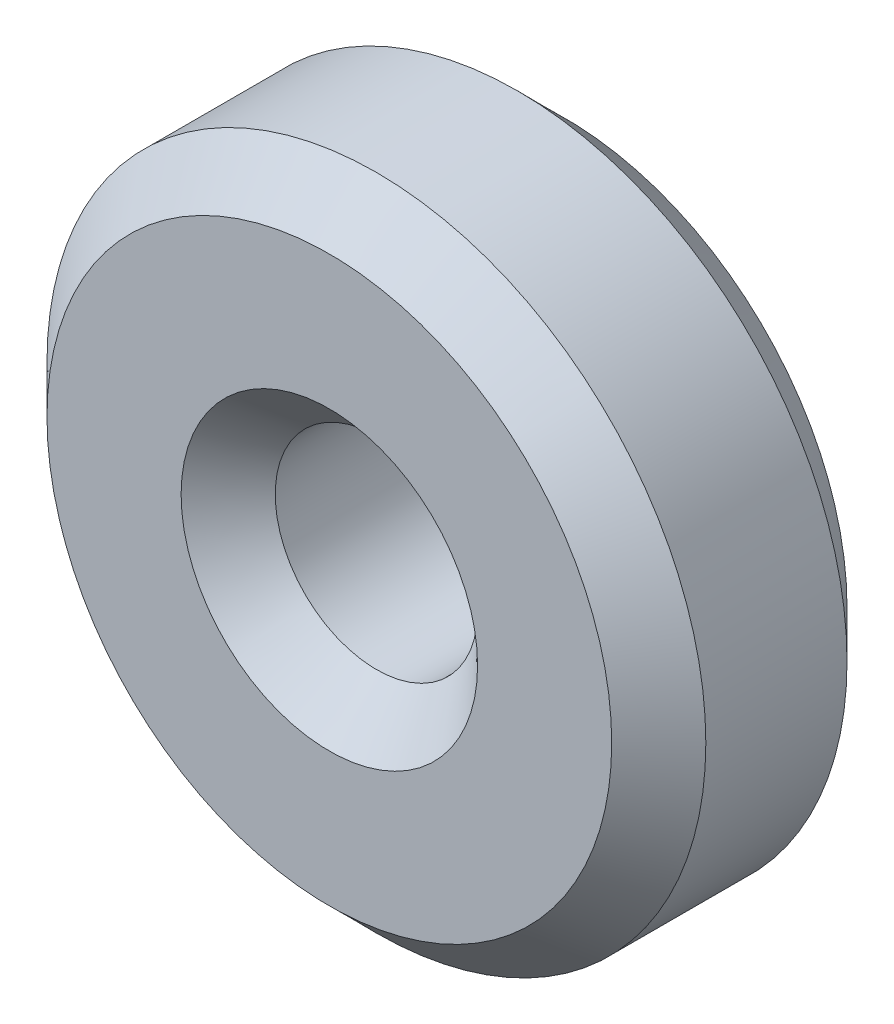
ISO-10303-21;
HEADER;
FILE_DESCRIPTION(('STEP AP214'),'2;1');
FILE_NAME('part.step','',(''),(''),'','','');
FILE_SCHEMA(('AUTOMOTIVE_DESIGN { 1 0 10303 214 1 1 1 1 }'));
ENDSEC;
DATA;
#1=APPLICATION_CONTEXT('core data for automotive mechanical design processes');
#2=APPLICATION_PROTOCOL_DEFINITION('international standard','automotive_design',2000,#1);
#3=PRODUCT_CONTEXT('',#1,'mechanical');
#4=PRODUCT('Part','Part','',(#3));
#5=PRODUCT_RELATED_PRODUCT_CATEGORY('part','',(#4));
#6=PRODUCT_DEFINITION_FORMATION('','',#4);
#7=PRODUCT_DEFINITION_CONTEXT('part definition',#1,'design');
#8=PRODUCT_DEFINITION('design','',#6,#7);
#9=PRODUCT_DEFINITION_SHAPE('','',#8);
#10=(LENGTH_UNIT() NAMED_UNIT(*) SI_UNIT(.MILLI.,.METRE.));
#11=(NAMED_UNIT(*) PLANE_ANGLE_UNIT() SI_UNIT($,.RADIAN.));
#12=(NAMED_UNIT(*) SI_UNIT($,.STERADIAN.) SOLID_ANGLE_UNIT());
#13=UNCERTAINTY_MEASURE_WITH_UNIT(LENGTH_MEASURE(1.E-05),#10,'distance_accuracy_value','');
#14=(GEOMETRIC_REPRESENTATION_CONTEXT(3) GLOBAL_UNCERTAINTY_ASSIGNED_CONTEXT((#13)) GLOBAL_UNIT_ASSIGNED_CONTEXT((#10,
#11,#12)) REPRESENTATION_CONTEXT('',''));
#15=CARTESIAN_POINT('',(0.,0.,0.));
#16=DIRECTION('',(0.,0.,1.));
#17=DIRECTION('',(1.,0.,0.));
#18=AXIS2_PLACEMENT_3D('',#15,#16,#17);
#19=CARTESIAN_POINT('',(0.,0.,5.));
#20=DIRECTION('',(0.,0.,1.));
#21=DIRECTION('',(1.,0.,0.));
#22=AXIS2_PLACEMENT_3D('',#19,#20,#21);
#23=PLANE('',#22);
#24=CARTESIAN_POINT('',(0.,0.,5.));
#25=DIRECTION('',(0.,0.,1.));
#26=DIRECTION('',(1.,0.,0.));
#27=AXIS2_PLACEMENT_3D('',#24,#25,#26);
#28=CIRCLE('',#27,3.15000000000001);
#29=CARTESIAN_POINT('',(3.15000000000001,0.,5.));
#30=VERTEX_POINT('',#29);
#31=EDGE_CURVE('E53',#30,#30,#28,.F.);
#32=ORIENTED_EDGE('',*,*,#31,.T.);
#33=EDGE_LOOP('',(#32));
#34=FACE_BOUND('',#33,.T.);
#35=CARTESIAN_POINT('',(0.,0.,5.));
#36=DIRECTION('',(0.,0.,1.));
#37=DIRECTION('',(1.,0.,0.));
#38=AXIS2_PLACEMENT_3D('',#35,#36,#37);
#39=CIRCLE('',#38,6.);
#40=CARTESIAN_POINT('',(6.,0.,5.));
#41=VERTEX_POINT('',#40);
#42=EDGE_CURVE('E56',#41,#41,#39,.T.);
#43=ORIENTED_EDGE('',*,*,#42,.T.);
#44=EDGE_LOOP('',(#43));
#45=FACE_BOUND('',#44,.T.);
#46=ADVANCED_FACE('F33',(#34,#45),#23,.T.);
#47=CARTESIAN_POINT('',(0.,0.,0.));
#48=DIRECTION('',(0.,0.,1.));
#49=DIRECTION('',(1.,0.,0.));
#50=AXIS2_PLACEMENT_3D('',#47,#48,#49);
#51=PLANE('',#50);
#52=CARTESIAN_POINT('',(0.,0.,0.));
#53=DIRECTION('',(0.,0.,1.));
#54=DIRECTION('',(1.,0.,0.));
#55=AXIS2_PLACEMENT_3D('',#52,#53,#54);
#56=CIRCLE('',#55,3.15);
#57=CARTESIAN_POINT('',(3.15,0.,0.));
#58=VERTEX_POINT('',#57);
#59=EDGE_CURVE('E10',#58,#58,#56,.T.);
#60=ORIENTED_EDGE('',*,*,#59,.T.);
#61=EDGE_LOOP('',(#60));
#62=FACE_BOUND('',#61,.T.);
#63=CARTESIAN_POINT('',(0.,0.,0.));
#64=DIRECTION('',(0.,0.,1.));
#65=DIRECTION('',(1.,0.,0.));
#66=AXIS2_PLACEMENT_3D('',#63,#64,#65);
#67=CIRCLE('',#66,5.99999999999999);
#68=CARTESIAN_POINT('',(5.99999999999999,0.,0.));
#69=VERTEX_POINT('',#68);
#70=EDGE_CURVE('E40',#69,#69,#67,.F.);
#71=ORIENTED_EDGE('',*,*,#70,.T.);
#72=EDGE_LOOP('',(#71));
#73=FACE_BOUND('',#72,.T.);
#74=ADVANCED_FACE('F81',(#62,#73),#51,.F.);
#75=CARTESIAN_POINT('',(0.,0.,5.));
#76=DIRECTION('',(0.,0.,-1.));
#77=DIRECTION('',(-1.,0.,0.));
#78=AXIS2_PLACEMENT_3D('',#75,#76,#77);
#79=CYLINDRICAL_SURFACE('',#78,7.);
#80=CARTESIAN_POINT('',(0.,0.,4.));
#81=DIRECTION('',(0.,0.,1.));
#82=DIRECTION('',(1.,0.,0.));
#83=AXIS2_PLACEMENT_3D('',#80,#81,#82);
#84=CIRCLE('',#83,7.);
#85=CARTESIAN_POINT('',(7.,0.,4.));
#86=VERTEX_POINT('',#85);
#87=EDGE_CURVE('E44',#86,#86,#84,.F.);
#88=ORIENTED_EDGE('',*,*,#87,.T.);
#89=EDGE_LOOP('',(#88));
#90=FACE_BOUND('',#89,.T.);
#91=CARTESIAN_POINT('',(0.,0.,1.));
#92=DIRECTION('',(0.,0.,1.));
#93=DIRECTION('',(1.,0.,0.));
#94=AXIS2_PLACEMENT_3D('',#91,#92,#93);
#95=CIRCLE('',#94,7.);
#96=CARTESIAN_POINT('',(7.,0.,1.));
#97=VERTEX_POINT('',#96);
#98=EDGE_CURVE('E48',#97,#97,#95,.T.);
#99=ORIENTED_EDGE('',*,*,#98,.T.);
#100=EDGE_LOOP('',(#99));
#101=FACE_BOUND('',#100,.T.);
#102=ADVANCED_FACE('F87',(#90,#101),#79,.T.);
#103=CARTESIAN_POINT('',(0.,0.,5.));
#104=DIRECTION('',(0.,0.,-1.));
#105=DIRECTION('',(-1.,0.,0.));
#106=AXIS2_PLACEMENT_3D('',#103,#104,#105);
#107=CYLINDRICAL_SURFACE('',#106,2.15);
#108=CARTESIAN_POINT('',(0.,0.,4.));
#109=DIRECTION('',(0.,0.,1.));
#110=DIRECTION('',(1.,0.,0.));
#111=AXIS2_PLACEMENT_3D('',#108,#109,#110);
#112=CIRCLE('',#111,2.15);
#113=CARTESIAN_POINT('',(2.15,0.,4.));
#114=VERTEX_POINT('',#113);
#115=EDGE_CURVE('E59',#114,#114,#112,.T.);
#116=ORIENTED_EDGE('',*,*,#115,.T.);
#117=EDGE_LOOP('',(#116));
#118=FACE_BOUND('',#117,.T.);
#119=CARTESIAN_POINT('',(0.,0.,1.));
#120=DIRECTION('',(0.,0.,1.));
#121=DIRECTION('',(1.,0.,0.));
#122=AXIS2_PLACEMENT_3D('',#119,#120,#121);
#123=CIRCLE('',#122,2.15);
#124=CARTESIAN_POINT('',(2.15,0.,1.));
#125=VERTEX_POINT('',#124);
#126=EDGE_CURVE('E62',#125,#125,#123,.F.);
#127=ORIENTED_EDGE('',*,*,#126,.T.);
#128=EDGE_LOOP('',(#127));
#129=FACE_BOUND('',#128,.T.);
#130=ADVANCED_FACE('F66',(#118,#129),#107,.F.);
#131=CARTESIAN_POINT('',(0.,0.,4.));
#132=DIRECTION('',(0.,0.,1.));
#133=DIRECTION('',(1.,0.,0.));
#134=AXIS2_PLACEMENT_3D('',#131,#132,#133);
#135=CONICAL_SURFACE('',#134,2.15,0.785398163397451);
#136=ORIENTED_EDGE('',*,*,#31,.F.);
#137=EDGE_LOOP('',(#136));
#138=FACE_BOUND('',#137,.T.);
#139=ORIENTED_EDGE('',*,*,#115,.F.);
#140=EDGE_LOOP('',(#139));
#141=FACE_BOUND('',#140,.T.);
#142=ADVANCED_FACE('F77',(#138,#141),#135,.F.);
#143=CARTESIAN_POINT('',(0.,0.,5.));
#144=DIRECTION('',(0.,0.,-1.));
#145=DIRECTION('',(-1.,0.,0.));
#146=AXIS2_PLACEMENT_3D('',#143,#144,#145);
#147=CONICAL_SURFACE('',#146,6.,0.785398163397446);
#148=ORIENTED_EDGE('',*,*,#87,.F.);
#149=EDGE_LOOP('',(#148));
#150=FACE_BOUND('',#149,.T.);
#151=ORIENTED_EDGE('',*,*,#42,.F.);
#152=EDGE_LOOP('',(#151));
#153=FACE_BOUND('',#152,.T.);
#154=ADVANCED_FACE('F71',(#150,#153),#147,.T.);
#155=CARTESIAN_POINT('',(0.,0.,0.));
#156=DIRECTION('',(0.,0.,-1.));
#157=DIRECTION('',(-1.,0.,0.));
#158=AXIS2_PLACEMENT_3D('',#155,#156,#157);
#159=CONICAL_SURFACE('',#158,3.15,0.785398163397446);
#160=ORIENTED_EDGE('',*,*,#126,.F.);
#161=EDGE_LOOP('',(#160));
#162=FACE_BOUND('',#161,.T.);
#163=ORIENTED_EDGE('',*,*,#59,.F.);
#164=EDGE_LOOP('',(#163));
#165=FACE_BOUND('',#164,.T.);
#166=ADVANCED_FACE('F68',(#162,#165),#159,.F.);
#167=CARTESIAN_POINT('',(0.,0.,1.));
#168=DIRECTION('',(0.,0.,1.));
#169=DIRECTION('',(1.,0.,0.));
#170=AXIS2_PLACEMENT_3D('',#167,#168,#169);
#171=CONICAL_SURFACE('',#170,7.,0.785398163397451);
#172=ORIENTED_EDGE('',*,*,#70,.F.);
#173=EDGE_LOOP('',(#172));
#174=FACE_BOUND('',#173,.T.);
#175=ORIENTED_EDGE('',*,*,#98,.F.);
#176=EDGE_LOOP('',(#175));
#177=FACE_BOUND('',#176,.T.);
#178=ADVANCED_FACE('F35',(#174,#177),#171,.T.);
#179=CLOSED_SHELL('',(#46,#74,#102,#130,#142,#154,#166,#178));
#180=MANIFOLD_SOLID_BREP('B2',#179);
#181=ADVANCED_BREP_SHAPE_REPRESENTATION('',(#18,#180),#14);
#182=SHAPE_DEFINITION_REPRESENTATION(#9,#181);
ENDSEC;
END-ISO-10303-21;
